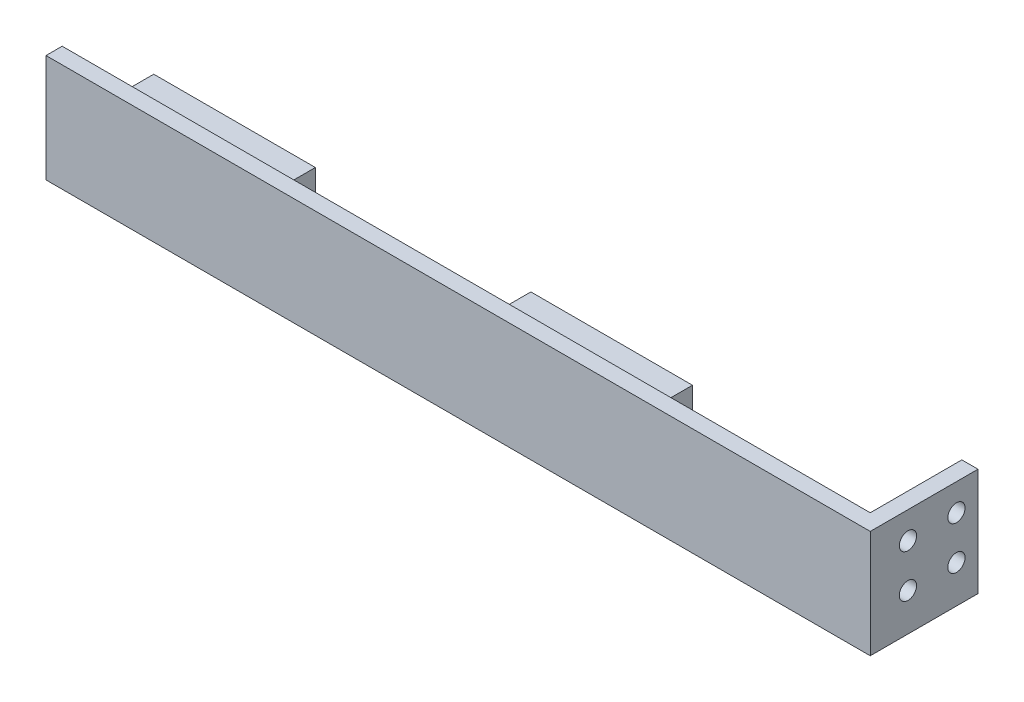
ISO-10303-21;
HEADER;
FILE_DESCRIPTION(('STEP AP214'),'2;1');
FILE_NAME('part.step','',(''),(''),'','','');
FILE_SCHEMA(('AUTOMOTIVE_DESIGN { 1 0 10303 214 1 1 1 1 }'));
ENDSEC;
DATA;
#1=APPLICATION_CONTEXT('core data for automotive mechanical design processes');
#2=APPLICATION_PROTOCOL_DEFINITION('international standard','automotive_design',2000,#1);
#3=PRODUCT_CONTEXT('',#1,'mechanical');
#4=PRODUCT('Part','Part','',(#3));
#5=PRODUCT_RELATED_PRODUCT_CATEGORY('part','',(#4));
#6=PRODUCT_DEFINITION_FORMATION('','',#4);
#7=PRODUCT_DEFINITION_CONTEXT('part definition',#1,'design');
#8=PRODUCT_DEFINITION('design','',#6,#7);
#9=PRODUCT_DEFINITION_SHAPE('','',#8);
#10=(LENGTH_UNIT() NAMED_UNIT(*) SI_UNIT(.MILLI.,.METRE.));
#11=(NAMED_UNIT(*) PLANE_ANGLE_UNIT() SI_UNIT($,.RADIAN.));
#12=(NAMED_UNIT(*) SI_UNIT($,.STERADIAN.) SOLID_ANGLE_UNIT());
#13=UNCERTAINTY_MEASURE_WITH_UNIT(LENGTH_MEASURE(1.E-05),#10,'distance_accuracy_value','');
#14=(GEOMETRIC_REPRESENTATION_CONTEXT(3) GLOBAL_UNCERTAINTY_ASSIGNED_CONTEXT((#13)) GLOBAL_UNIT_ASSIGNED_CONTEXT((#10,
#11,#12)) REPRESENTATION_CONTEXT('',''));
#15=CARTESIAN_POINT('',(0.,0.,0.));
#16=DIRECTION('',(0.,0.,1.));
#17=DIRECTION('',(1.,0.,0.));
#18=AXIS2_PLACEMENT_3D('',#15,#16,#17);
#19=CARTESIAN_POINT('',(-150.,-16.5012014745877,102.245468700612));
#20=DIRECTION('',(0.,0.707106781186551,-0.707106781186544));
#21=DIRECTION('',(-1.,0.,0.));
#22=AXIS2_PLACEMENT_3D('',#19,#20,#21);
#23=PLANE('',#22);
#24=DIRECTION('',(0.,0.707106781186544,0.707106781186551));
#25=VECTOR('',#24,1.);
#26=CARTESIAN_POINT('',(-116.9,-16.5012014745877,102.245468700612));
#27=LINE('',#26,#25);
#28=CARTESIAN_POINT('',(-116.9,-13.5012014745877,105.245468700612));
#29=VERTEX_POINT('',#28);
#30=CARTESIAN_POINT('',(-116.9,-16.5012014745877,102.245468700612));
#31=VERTEX_POINT('',#30);
#32=EDGE_CURVE('E11',#29,#31,#27,.F.);
#33=ORIENTED_EDGE('',*,*,#32,.F.);
#34=DIRECTION('',(-1.,0.,0.));
#35=VECTOR('',#34,1.);
#36=CARTESIAN_POINT('',(-120.,-13.5012014745877,105.245468700612));
#37=LINE('',#36,#35);
#38=CARTESIAN_POINT('',(-83.1,-13.5012014745877,105.245468700612));
#39=VERTEX_POINT('',#38);
#40=EDGE_CURVE('E175',#39,#29,#37,.T.);
#41=ORIENTED_EDGE('',*,*,#40,.F.);
#42=DIRECTION('',(0.,-0.707106781186544,-0.707106781186551));
#43=VECTOR('',#42,1.);
#44=CARTESIAN_POINT('',(-83.1,-16.5012014745877,102.245468700612));
#45=LINE('',#44,#43);
#46=CARTESIAN_POINT('',(-83.1,-16.5012014745877,102.245468700612));
#47=VERTEX_POINT('',#46);
#48=EDGE_CURVE('E47',#47,#39,#45,.F.);
#49=ORIENTED_EDGE('',*,*,#48,.F.);
#50=DIRECTION('',(1.,0.,0.));
#51=VECTOR('',#50,1.);
#52=CARTESIAN_POINT('',(-80.,-16.5012014745877,102.245468700612));
#53=LINE('',#52,#51);
#54=EDGE_CURVE('E176',#31,#47,#53,.T.);
#55=ORIENTED_EDGE('',*,*,#54,.F.);
#56=EDGE_LOOP('',(#33,#41,#49,#55));
#57=FACE_BOUND('',#56,.T.);
#58=ADVANCED_FACE('F39',(#57),#23,.T.);
#59=CARTESIAN_POINT('',(-150.,-16.5012014745877,102.245468700612));
#60=DIRECTION('',(0.,0.707106781186551,-0.707106781186544));
#61=DIRECTION('',(-1.,0.,0.));
#62=AXIS2_PLACEMENT_3D('',#59,#60,#61);
#63=PLANE('',#62);
#64=DIRECTION('',(0.,0.707106781186544,0.707106781186551));
#65=VECTOR('',#64,1.);
#66=CARTESIAN_POINT('',(-46.9,-16.5012014745876,102.245468700612));
#67=LINE('',#66,#65);
#68=CARTESIAN_POINT('',(-46.9,-13.5012014745877,105.245468700612));
#69=VERTEX_POINT('',#68);
#70=CARTESIAN_POINT('',(-46.9,-16.5012014745877,102.245468700612));
#71=VERTEX_POINT('',#70);
#72=EDGE_CURVE('E192',#69,#71,#67,.F.);
#73=ORIENTED_EDGE('',*,*,#72,.F.);
#74=DIRECTION('',(-1.,0.,0.));
#75=VECTOR('',#74,1.);
#76=CARTESIAN_POINT('',(-50.,-13.5012014745877,105.245468700612));
#77=LINE('',#76,#75);
#78=CARTESIAN_POINT('',(0.,-13.5012014745877,105.245468700612));
#79=VERTEX_POINT('',#78);
#80=EDGE_CURVE('E183',#79,#69,#77,.T.);
#81=ORIENTED_EDGE('',*,*,#80,.F.);
#82=DIRECTION('',(0.,-0.707106781186544,-0.707106781186551));
#83=VECTOR('',#82,1.);
#84=CARTESIAN_POINT('',(0.,-59.3733350875997,59.3733350875992));
#85=LINE('',#84,#83);
#86=CARTESIAN_POINT('',(0.,-16.5012014745877,102.245468700612));
#87=VERTEX_POINT('',#86);
#88=EDGE_CURVE('E185',#87,#79,#85,.F.);
#89=ORIENTED_EDGE('',*,*,#88,.F.);
#90=DIRECTION('',(1.,0.,0.));
#91=VECTOR('',#90,1.);
#92=CARTESIAN_POINT('',(0.,-16.5012014745877,102.245468700612));
#93=LINE('',#92,#91);
#94=EDGE_CURVE('E182',#71,#87,#93,.T.);
#95=ORIENTED_EDGE('',*,*,#94,.F.);
#96=EDGE_LOOP('',(#73,#81,#89,#95));
#97=FACE_BOUND('',#96,.T.);
#98=ADVANCED_FACE('F41',(#97),#63,.T.);
#99=CARTESIAN_POINT('',(-72.,-19.5012014745877,96.7454687006116));
#100=DIRECTION('',(0.,1.,0.));
#101=DIRECTION('',(0.,0.,1.));
#102=AXIS2_PLACEMENT_3D('',#99,#100,#101);
#103=CYLINDRICAL_SURFACE('',#102,2.1);
#104=CARTESIAN_POINT('',(-72.,-12.5012014745877,96.7454687006116));
#105=DIRECTION('',(0.,1.,0.));
#106=DIRECTION('',(0.,0.,1.));
#107=AXIS2_PLACEMENT_3D('',#104,#105,#106);
#108=CIRCLE('',#107,2.1);
#109=CARTESIAN_POINT('',(-72.,-12.5012014745877,98.8454687006116));
#110=VERTEX_POINT('',#109);
#111=EDGE_CURVE('E332',#110,#110,#108,.T.);
#112=ORIENTED_EDGE('',*,*,#111,.T.);
#113=EDGE_LOOP('',(#112));
#114=FACE_BOUND('',#113,.T.);
#115=CARTESIAN_POINT('',(-72.,-17.0012014745877,96.7454687006116));
#116=DIRECTION('',(0.,-1.,0.));
#117=DIRECTION('',(0.,0.,-1.));
#118=AXIS2_PLACEMENT_3D('',#115,#116,#117);
#119=CIRCLE('',#118,2.1);
#120=CARTESIAN_POINT('',(-72.,-17.0012014745877,94.6454687006116));
#121=VERTEX_POINT('',#120);
#122=EDGE_CURVE('E204',#121,#121,#119,.F.);
#123=ORIENTED_EDGE('',*,*,#122,.F.);
#124=EDGE_LOOP('',(#123));
#125=FACE_BOUND('',#124,.T.);
#126=ADVANCED_FACE('F423',(#114,#125),#103,.F.);
#127=CARTESIAN_POINT('',(-58.,-19.5012014745877,96.7454687006116));
#128=DIRECTION('',(0.,1.,0.));
#129=DIRECTION('',(0.,0.,1.));
#130=AXIS2_PLACEMENT_3D('',#127,#128,#129);
#131=CYLINDRICAL_SURFACE('',#130,2.04999999999999);
#132=CARTESIAN_POINT('',(-58.,-12.5012014745877,96.7454687006116));
#133=DIRECTION('',(0.,1.,0.));
#134=DIRECTION('',(0.,0.,1.));
#135=AXIS2_PLACEMENT_3D('',#132,#133,#134);
#136=CIRCLE('',#135,2.04999999999999);
#137=CARTESIAN_POINT('',(-58.,-12.5012014745877,98.7954687006116));
#138=VERTEX_POINT('',#137);
#139=EDGE_CURVE('E320',#138,#138,#136,.T.);
#140=ORIENTED_EDGE('',*,*,#139,.T.);
#141=EDGE_LOOP('',(#140));
#142=FACE_BOUND('',#141,.T.);
#143=CARTESIAN_POINT('',(-58.,-17.0012014745877,96.7454687006116));
#144=DIRECTION('',(0.,-1.,0.));
#145=DIRECTION('',(0.,0.,-1.));
#146=AXIS2_PLACEMENT_3D('',#143,#144,#145);
#147=CIRCLE('',#146,2.04999999999999);
#148=CARTESIAN_POINT('',(-58.,-17.0012014745877,94.6954687006116));
#149=VERTEX_POINT('',#148);
#150=EDGE_CURVE('E208',#149,#149,#147,.F.);
#151=ORIENTED_EDGE('',*,*,#150,.F.);
#152=EDGE_LOOP('',(#151));
#153=FACE_BOUND('',#152,.T.);
#154=ADVANCED_FACE('F490',(#142,#153),#131,.F.);
#155=CARTESIAN_POINT('',(-142.,-19.5012014745877,96.7454687006116));
#156=DIRECTION('',(0.,1.,0.));
#157=DIRECTION('',(0.,0.,1.));
#158=AXIS2_PLACEMENT_3D('',#155,#156,#157);
#159=CYLINDRICAL_SURFACE('',#158,2.09999999999999);
#160=CARTESIAN_POINT('',(-142.,-12.5012014745877,96.7454687006116));
#161=DIRECTION('',(0.,1.,0.));
#162=DIRECTION('',(0.,0.,1.));
#163=AXIS2_PLACEMENT_3D('',#160,#161,#162);
#164=CIRCLE('',#163,2.09999999999999);
#165=CARTESIAN_POINT('',(-142.,-12.5012014745877,98.8454687006116));
#166=VERTEX_POINT('',#165);
#167=EDGE_CURVE('E207',#166,#166,#164,.T.);
#168=ORIENTED_EDGE('',*,*,#167,.T.);
#169=EDGE_LOOP('',(#168));
#170=FACE_BOUND('',#169,.T.);
#171=CARTESIAN_POINT('',(-142.,-17.0012014745877,96.7454687006116));
#172=DIRECTION('',(0.,-1.,0.));
#173=DIRECTION('',(0.,0.,-1.));
#174=AXIS2_PLACEMENT_3D('',#171,#172,#173);
#175=CIRCLE('',#174,2.09999999999999);
#176=CARTESIAN_POINT('',(-142.,-17.0012014745877,94.6454687006116));
#177=VERTEX_POINT('',#176);
#178=EDGE_CURVE('E211',#177,#177,#175,.F.);
#179=ORIENTED_EDGE('',*,*,#178,.F.);
#180=EDGE_LOOP('',(#179));
#181=FACE_BOUND('',#180,.T.);
#182=ADVANCED_FACE('F487',(#170,#181),#159,.F.);
#183=CARTESIAN_POINT('',(-128.,-19.5012014745877,96.7454687006116));
#184=DIRECTION('',(0.,1.,0.));
#185=DIRECTION('',(0.,0.,1.));
#186=AXIS2_PLACEMENT_3D('',#183,#184,#185);
#187=CYLINDRICAL_SURFACE('',#186,2.10000000000002);
#188=CARTESIAN_POINT('',(-128.,-12.5012014745877,96.7454687006116));
#189=DIRECTION('',(0.,1.,0.));
#190=DIRECTION('',(0.,0.,1.));
#191=AXIS2_PLACEMENT_3D('',#188,#189,#190);
#192=CIRCLE('',#191,2.10000000000002);
#193=CARTESIAN_POINT('',(-128.,-12.5012014745877,98.8454687006116));
#194=VERTEX_POINT('',#193);
#195=EDGE_CURVE('E329',#194,#194,#192,.T.);
#196=ORIENTED_EDGE('',*,*,#195,.T.);
#197=EDGE_LOOP('',(#196));
#198=FACE_BOUND('',#197,.T.);
#199=CARTESIAN_POINT('',(-128.,-17.0012014745877,96.7454687006116));
#200=DIRECTION('',(0.,-1.,0.));
#201=DIRECTION('',(0.,0.,-1.));
#202=AXIS2_PLACEMENT_3D('',#199,#200,#201);
#203=CIRCLE('',#202,2.10000000000002);
#204=CARTESIAN_POINT('',(-128.,-17.0012014745877,94.6454687006116));
#205=VERTEX_POINT('',#204);
#206=EDGE_CURVE('E214',#205,#205,#203,.F.);
#207=ORIENTED_EDGE('',*,*,#206,.F.);
#208=EDGE_LOOP('',(#207));
#209=FACE_BOUND('',#208,.T.);
#210=ADVANCED_FACE('F449',(#198,#209),#187,.F.);
#211=CARTESIAN_POINT('',(-150.,-19.5012014745877,105.245468700612));
#212=DIRECTION('',(0.,0.,1.));
#213=DIRECTION('',(1.,0.,0.));
#214=AXIS2_PLACEMENT_3D('',#211,#212,#213);
#215=PLANE('',#214);
#216=DIRECTION('',(0.,-1.,0.));
#217=VECTOR('',#216,1.);
#218=CARTESIAN_POINT('',(-80.,-12.5012014745877,105.245468700612));
#219=LINE('',#218,#217);
#220=CARTESIAN_POINT('',(-80.,-12.5012014745877,105.245468700612));
#221=VERTEX_POINT('',#220);
#222=CARTESIAN_POINT('',(-80.,-16.5012014745877,105.245468700612));
#223=VERTEX_POINT('',#222);
#224=EDGE_CURVE('E296',#221,#223,#219,.T.);
#225=ORIENTED_EDGE('',*,*,#224,.T.);
#226=DIRECTION('',(1.,0.,0.));
#227=VECTOR('',#226,1.);
#228=CARTESIAN_POINT('',(-80.,-16.5012014745877,105.245468700612));
#229=LINE('',#228,#227);
#230=CARTESIAN_POINT('',(-83.1,-16.5012014745877,105.245468700612));
#231=VERTEX_POINT('',#230);
#232=EDGE_CURVE('E367',#231,#223,#229,.T.);
#233=ORIENTED_EDGE('',*,*,#232,.F.);
#234=DIRECTION('',(0.,-1.,0.));
#235=VECTOR('',#234,1.);
#236=CARTESIAN_POINT('',(-83.1,-13.5012014745877,105.245468700612));
#237=LINE('',#236,#235);
#238=EDGE_CURVE('E181',#39,#231,#237,.T.);
#239=ORIENTED_EDGE('',*,*,#238,.F.);
#240=ORIENTED_EDGE('',*,*,#40,.T.);
#241=DIRECTION('',(0.,-1.,0.));
#242=VECTOR('',#241,1.);
#243=CARTESIAN_POINT('',(-116.9,-13.5012014745877,105.245468700612));
#244=LINE('',#243,#242);
#245=CARTESIAN_POINT('',(-116.9,-16.5012014745877,105.245468700612));
#246=VERTEX_POINT('',#245);
#247=EDGE_CURVE('E163',#29,#246,#244,.T.);
#248=ORIENTED_EDGE('',*,*,#247,.T.);
#249=DIRECTION('',(1.,0.,0.));
#250=VECTOR('',#249,1.);
#251=CARTESIAN_POINT('',(-120.,-16.5012014745877,105.245468700612));
#252=LINE('',#251,#250);
#253=CARTESIAN_POINT('',(-120.,-16.5012014745877,105.245468700612));
#254=VERTEX_POINT('',#253);
#255=EDGE_CURVE('E366',#254,#246,#252,.T.);
#256=ORIENTED_EDGE('',*,*,#255,.F.);
#257=DIRECTION('',(0.,-1.,0.));
#258=VECTOR('',#257,1.);
#259=CARTESIAN_POINT('',(-120.,-12.5012014745877,105.245468700612));
#260=LINE('',#259,#258);
#261=CARTESIAN_POINT('',(-120.,-12.5012014745877,105.245468700612));
#262=VERTEX_POINT('',#261);
#263=EDGE_CURVE('E274',#262,#254,#260,.T.);
#264=ORIENTED_EDGE('',*,*,#263,.F.);
#265=DIRECTION('',(1.,0.,0.));
#266=VECTOR('',#265,1.);
#267=CARTESIAN_POINT('',(-150.,-12.5012014745877,105.245468700612));
#268=LINE('',#267,#266);
#269=CARTESIAN_POINT('',(-150.,-12.5012014745877,105.245468700612));
#270=VERTEX_POINT('',#269);
#271=EDGE_CURVE('E301',#270,#262,#268,.T.);
#272=ORIENTED_EDGE('',*,*,#271,.F.);
#273=DIRECTION('',(0.,-1.,0.));
#274=VECTOR('',#273,1.);
#275=CARTESIAN_POINT('',(-150.,-19.5012014745877,105.245468700612));
#276=LINE('',#275,#274);
#277=CARTESIAN_POINT('',(-150.,0.498798525412329,105.245468700612));
#278=VERTEX_POINT('',#277);
#279=EDGE_CURVE('E248',#278,#270,#276,.T.);
#280=ORIENTED_EDGE('',*,*,#279,.F.);
#281=DIRECTION('',(1.,0.,0.));
#282=VECTOR('',#281,1.);
#283=CARTESIAN_POINT('',(-150.,0.498798525412329,105.245468700612));
#284=LINE('',#283,#282);
#285=CARTESIAN_POINT('',(0.,0.498798525412329,105.245468700612));
#286=VERTEX_POINT('',#285);
#287=EDGE_CURVE('E230',#278,#286,#284,.T.);
#288=ORIENTED_EDGE('',*,*,#287,.T.);
#289=DIRECTION('',(0.,-1.,0.));
#290=VECTOR('',#289,1.);
#291=CARTESIAN_POINT('',(0.,-19.5012014745877,105.245468700612));
#292=LINE('',#291,#290);
#293=EDGE_CURVE('E241',#286,#79,#292,.T.);
#294=ORIENTED_EDGE('',*,*,#293,.T.);
#295=ORIENTED_EDGE('',*,*,#80,.T.);
#296=DIRECTION('',(0.,-1.,0.));
#297=VECTOR('',#296,1.);
#298=CARTESIAN_POINT('',(-46.9,-13.5012014745877,105.245468700612));
#299=LINE('',#298,#297);
#300=CARTESIAN_POINT('',(-46.9,-16.5012014745877,105.245468700612));
#301=VERTEX_POINT('',#300);
#302=EDGE_CURVE('E359',#69,#301,#299,.T.);
#303=ORIENTED_EDGE('',*,*,#302,.T.);
#304=DIRECTION('',(1.,0.,0.));
#305=VECTOR('',#304,1.);
#306=CARTESIAN_POINT('',(-50.,-16.5012014745877,105.245468700612));
#307=LINE('',#306,#305);
#308=CARTESIAN_POINT('',(-50.,-16.5012014745877,105.245468700612));
#309=VERTEX_POINT('',#308);
#310=EDGE_CURVE('E363',#309,#301,#307,.T.);
#311=ORIENTED_EDGE('',*,*,#310,.F.);
#312=DIRECTION('',(0.,-1.,0.));
#313=VECTOR('',#312,1.);
#314=CARTESIAN_POINT('',(-50.,-12.5012014745877,105.245468700612));
#315=LINE('',#314,#313);
#316=CARTESIAN_POINT('',(-50.,-12.5012014745877,105.245468700612));
#317=VERTEX_POINT('',#316);
#318=EDGE_CURVE('E305',#317,#309,#315,.T.);
#319=ORIENTED_EDGE('',*,*,#318,.F.);
#320=DIRECTION('',(1.,0.,0.));
#321=VECTOR('',#320,1.);
#322=CARTESIAN_POINT('',(-80.,-12.5012014745877,105.245468700612));
#323=LINE('',#322,#321);
#324=EDGE_CURVE('E324',#221,#317,#323,.T.);
#325=ORIENTED_EDGE('',*,*,#324,.F.);
#326=EDGE_LOOP('',(#225,#233,#239,#240,#248,#256,#264,#272,#280,#288,#294,#295,#303,#311,#319,#325));
#327=FACE_BOUND('',#326,.T.);
#328=ADVANCED_FACE('F178',(#327),#215,.F.);
#329=CARTESIAN_POINT('',(-150.,-16.5012014745877,88.2454687006116));
#330=DIRECTION('',(0.,-1.,0.));
#331=DIRECTION('',(0.,0.,-1.));
#332=AXIS2_PLACEMENT_3D('',#329,#330,#331);
#333=PLANE('',#332);
#334=DIRECTION('',(0.,0.,1.));
#335=VECTOR('',#334,1.);
#336=CARTESIAN_POINT('',(-80.,-16.5012014745877,105.245468700612));
#337=LINE('',#336,#335);
#338=CARTESIAN_POINT('',(-80.,-16.5012014745877,88.2454687006116));
#339=VERTEX_POINT('',#338);
#340=EDGE_CURVE('E317',#339,#223,#337,.T.);
#341=ORIENTED_EDGE('',*,*,#340,.F.);
#342=DIRECTION('',(1.,0.,0.));
#343=VECTOR('',#342,1.);
#344=CARTESIAN_POINT('',(-150.,-16.5012014745877,88.2454687006116));
#345=LINE('',#344,#343);
#346=CARTESIAN_POINT('',(-120.,-16.5012014745877,88.2454687006116));
#347=VERTEX_POINT('',#346);
#348=EDGE_CURVE('E245',#347,#339,#345,.T.);
#349=ORIENTED_EDGE('',*,*,#348,.F.);
#350=DIRECTION('',(0.,0.,-1.));
#351=VECTOR('',#350,1.);
#352=CARTESIAN_POINT('',(-120.,-16.5012014745877,88.2454687006116));
#353=LINE('',#352,#351);
#354=EDGE_CURVE('E292',#254,#347,#353,.T.);
#355=ORIENTED_EDGE('',*,*,#354,.F.);
#356=ORIENTED_EDGE('',*,*,#255,.T.);
#357=DIRECTION('',(0.,0.,-1.));
#358=VECTOR('',#357,1.);
#359=CARTESIAN_POINT('',(-116.9,-16.5012014745877,88.2454687006116));
#360=LINE('',#359,#358);
#361=EDGE_CURVE('E54',#246,#31,#360,.T.);
#362=ORIENTED_EDGE('',*,*,#361,.T.);
#363=ORIENTED_EDGE('',*,*,#54,.T.);
#364=DIRECTION('',(0.,0.,1.));
#365=VECTOR('',#364,1.);
#366=CARTESIAN_POINT('',(-83.1,-16.5012014745877,88.2454687006116));
#367=LINE('',#366,#365);
#368=EDGE_CURVE('E195',#47,#231,#367,.T.);
#369=ORIENTED_EDGE('',*,*,#368,.T.);
#370=ORIENTED_EDGE('',*,*,#232,.T.);
#371=EDGE_LOOP('',(#341,#349,#355,#356,#362,#363,#369,#370));
#372=FACE_BOUND('',#371,.T.);
#373=ADVANCED_FACE('F197',(#372),#333,.F.);
#374=DIRECTION('',(0.,0.,-1.));
#375=VECTOR('',#374,1.);
#376=CARTESIAN_POINT('',(-50.,-16.5012014745877,105.245468700612));
#377=LINE('',#376,#375);
#378=CARTESIAN_POINT('',(-50.,-16.5012014745877,88.2454687006116));
#379=VERTEX_POINT('',#378);
#380=EDGE_CURVE('E313',#309,#379,#377,.T.);
#381=ORIENTED_EDGE('',*,*,#380,.F.);
#382=ORIENTED_EDGE('',*,*,#310,.T.);
#383=DIRECTION('',(0.,0.,-1.));
#384=VECTOR('',#383,1.);
#385=CARTESIAN_POINT('',(-46.9,-16.5012014745877,88.2454687006116));
#386=LINE('',#385,#384);
#387=EDGE_CURVE('E61',#301,#71,#386,.T.);
#388=ORIENTED_EDGE('',*,*,#387,.T.);
#389=ORIENTED_EDGE('',*,*,#94,.T.);
#390=DIRECTION('',(0.,0.,-1.));
#391=VECTOR('',#390,1.);
#392=CARTESIAN_POINT('',(0.,-16.5012014745877,88.2454687006116));
#393=LINE('',#392,#391);
#394=CARTESIAN_POINT('',(0.,-16.5012014745877,88.2454687006116));
#395=VERTEX_POINT('',#394);
#396=EDGE_CURVE('E257',#87,#395,#393,.T.);
#397=ORIENTED_EDGE('',*,*,#396,.T.);
#398=EDGE_CURVE('E256',#379,#395,#345,.T.);
#399=ORIENTED_EDGE('',*,*,#398,.F.);
#400=EDGE_LOOP('',(#381,#382,#388,#389,#397,#399));
#401=FACE_BOUND('',#400,.T.);
#402=ADVANCED_FACE('F442',(#401),#333,.F.);
#403=CARTESIAN_POINT('',(0.,0.,0.));
#404=DIRECTION('',(-1.,0.,0.));
#405=DIRECTION('',(0.,0.,1.));
#406=AXIS2_PLACEMENT_3D('',#403,#404,#405);
#407=PLANE('',#406);
#408=CARTESIAN_POINT('',(0.,-12.5012014745877,101.245468700612));
#409=DIRECTION('',(1.,0.,0.));
#410=DIRECTION('',(0.,0.,-1.));
#411=AXIS2_PLACEMENT_3D('',#408,#409,#410);
#412=CIRCLE('',#411,1.6);
#413=CARTESIAN_POINT('',(0.,-12.5012014745877,99.6454687006116));
#414=VERTEX_POINT('',#413);
#415=EDGE_CURVE('E273',#414,#414,#412,.T.);
#416=ORIENTED_EDGE('',*,*,#415,.T.);
#417=EDGE_LOOP('',(#416));
#418=FACE_BOUND('',#417,.T.);
#419=CARTESIAN_POINT('',(0.,-12.5012014745877,92.2454687006116));
#420=DIRECTION('',(1.,0.,0.));
#421=DIRECTION('',(0.,0.,-1.));
#422=AXIS2_PLACEMENT_3D('',#419,#420,#421);
#423=CIRCLE('',#422,1.60000000000001);
#424=CARTESIAN_POINT('',(0.,-12.5012014745877,90.6454687006116));
#425=VERTEX_POINT('',#424);
#426=EDGE_CURVE('E280',#425,#425,#423,.T.);
#427=ORIENTED_EDGE('',*,*,#426,.T.);
#428=EDGE_LOOP('',(#427));
#429=FACE_BOUND('',#428,.T.);
#430=CARTESIAN_POINT('',(0.,-4.50120147458769,92.2454687006116));
#431=DIRECTION('',(1.,0.,0.));
#432=DIRECTION('',(0.,0.,-1.));
#433=AXIS2_PLACEMENT_3D('',#430,#431,#432);
#434=CIRCLE('',#433,1.60000000000001);
#435=CARTESIAN_POINT('',(0.,-4.50120147458769,90.6454687006116));
#436=VERTEX_POINT('',#435);
#437=EDGE_CURVE('E267',#436,#436,#434,.T.);
#438=ORIENTED_EDGE('',*,*,#437,.T.);
#439=EDGE_LOOP('',(#438));
#440=FACE_BOUND('',#439,.T.);
#441=CARTESIAN_POINT('',(0.,-4.50120147458769,101.245468700612));
#442=DIRECTION('',(1.,0.,0.));
#443=DIRECTION('',(0.,0.,-1.));
#444=AXIS2_PLACEMENT_3D('',#441,#442,#443);
#445=CIRCLE('',#444,1.60000000000001);
#446=CARTESIAN_POINT('',(0.,-4.50120147458769,99.6454687006116));
#447=VERTEX_POINT('',#446);
#448=EDGE_CURVE('E261',#447,#447,#445,.T.);
#449=ORIENTED_EDGE('',*,*,#448,.T.);
#450=EDGE_LOOP('',(#449));
#451=FACE_BOUND('',#450,.T.);
#452=ORIENTED_EDGE('',*,*,#396,.F.);
#453=ORIENTED_EDGE('',*,*,#88,.T.);
#454=ORIENTED_EDGE('',*,*,#293,.F.);
#455=DIRECTION('',(0.,0.,1.));
#456=VECTOR('',#455,1.);
#457=CARTESIAN_POINT('',(0.,0.498798525412329,88.2454687006116));
#458=LINE('',#457,#456);
#459=CARTESIAN_POINT('',(0.,0.498798525412329,88.2454687006116));
#460=VERTEX_POINT('',#459);
#461=EDGE_CURVE('E224',#460,#286,#458,.T.);
#462=ORIENTED_EDGE('',*,*,#461,.F.);
#463=DIRECTION('',(0.,1.,0.));
#464=VECTOR('',#463,1.);
#465=CARTESIAN_POINT('',(0.,0.498798525412329,88.2454687006116));
#466=LINE('',#465,#464);
#467=EDGE_CURVE('E228',#395,#460,#466,.T.);
#468=ORIENTED_EDGE('',*,*,#467,.F.);
#469=EDGE_LOOP('',(#452,#453,#454,#462,#468));
#470=FACE_BOUND('',#469,.T.);
#471=ADVANCED_FACE('F397',(#418,#429,#440,#451,#470),#407,.T.);
#472=CARTESIAN_POINT('',(3.,0.498798525412329,88.2454687006116));
#473=DIRECTION('',(0.,0.,1.));
#474=DIRECTION('',(1.,0.,0.));
#475=AXIS2_PLACEMENT_3D('',#472,#473,#474);
#476=PLANE('',#475);
#477=DIRECTION('',(-1.,0.,0.));
#478=VECTOR('',#477,1.);
#479=CARTESIAN_POINT('',(3.,-19.5012014745877,88.2454687006116));
#480=LINE('',#479,#478);
#481=CARTESIAN_POINT('',(3.,-19.5012014745877,88.2454687006116));
#482=VERTEX_POINT('',#481);
#483=CARTESIAN_POINT('',(-150.,-19.5012014745877,88.2454687006116));
#484=VERTEX_POINT('',#483);
#485=EDGE_CURVE('E221',#482,#484,#480,.T.);
#486=ORIENTED_EDGE('',*,*,#485,.T.);
#487=DIRECTION('',(0.,-1.,0.));
#488=VECTOR('',#487,1.);
#489=CARTESIAN_POINT('',(-150.,-19.5012014745877,88.2454687006116));
#490=LINE('',#489,#488);
#491=CARTESIAN_POINT('',(-150.,-12.5012014745877,88.2454687006116));
#492=VERTEX_POINT('',#491);
#493=EDGE_CURVE('E260',#492,#484,#490,.T.);
#494=ORIENTED_EDGE('',*,*,#493,.F.);
#495=DIRECTION('',(-1.,0.,0.));
#496=VECTOR('',#495,1.);
#497=CARTESIAN_POINT('',(-150.,-12.5012014745877,88.2454687006116));
#498=LINE('',#497,#496);
#499=CARTESIAN_POINT('',(-120.,-12.5012014745877,88.2454687006116));
#500=VERTEX_POINT('',#499);
#501=EDGE_CURVE('E291',#500,#492,#498,.T.);
#502=ORIENTED_EDGE('',*,*,#501,.F.);
#503=DIRECTION('',(0.,-1.,0.));
#504=VECTOR('',#503,1.);
#505=CARTESIAN_POINT('',(-120.,-12.5012014745877,88.2454687006116));
#506=LINE('',#505,#504);
#507=EDGE_CURVE('E289',#500,#347,#506,.T.);
#508=ORIENTED_EDGE('',*,*,#507,.T.);
#509=ORIENTED_EDGE('',*,*,#348,.T.);
#510=DIRECTION('',(0.,-1.,0.));
#511=VECTOR('',#510,1.);
#512=CARTESIAN_POINT('',(-80.,-12.5012014745877,88.2454687006116));
#513=LINE('',#512,#511);
#514=CARTESIAN_POINT('',(-80.,-12.5012014745877,88.2454687006116));
#515=VERTEX_POINT('',#514);
#516=EDGE_CURVE('E309',#515,#339,#513,.T.);
#517=ORIENTED_EDGE('',*,*,#516,.F.);
#518=DIRECTION('',(-1.,0.,0.));
#519=VECTOR('',#518,1.);
#520=CARTESIAN_POINT('',(-80.,-12.5012014745877,88.2454687006116));
#521=LINE('',#520,#519);
#522=CARTESIAN_POINT('',(-50.,-12.5012014745877,88.2454687006116));
#523=VERTEX_POINT('',#522);
#524=EDGE_CURVE('E312',#523,#515,#521,.T.);
#525=ORIENTED_EDGE('',*,*,#524,.F.);
#526=DIRECTION('',(0.,-1.,0.));
#527=VECTOR('',#526,1.);
#528=CARTESIAN_POINT('',(-50.,-12.5012014745877,88.2454687006116));
#529=LINE('',#528,#527);
#530=EDGE_CURVE('E307',#523,#379,#529,.T.);
#531=ORIENTED_EDGE('',*,*,#530,.T.);
#532=ORIENTED_EDGE('',*,*,#398,.T.);
#533=ORIENTED_EDGE('',*,*,#467,.T.);
#534=DIRECTION('',(-1.,0.,0.));
#535=VECTOR('',#534,1.);
#536=CARTESIAN_POINT('',(3.,0.498798525412329,88.2454687006116));
#537=LINE('',#536,#535);
#538=CARTESIAN_POINT('',(3.,0.498798525412329,88.2454687006116));
#539=VERTEX_POINT('',#538);
#540=EDGE_CURVE('E199',#539,#460,#537,.T.);
#541=ORIENTED_EDGE('',*,*,#540,.F.);
#542=DIRECTION('',(0.,1.,0.));
#543=VECTOR('',#542,1.);
#544=CARTESIAN_POINT('',(3.,0.498798525412329,88.2454687006116));
#545=LINE('',#544,#543);
#546=EDGE_CURVE('E227',#482,#539,#545,.T.);
#547=ORIENTED_EDGE('',*,*,#546,.F.);
#548=EDGE_LOOP('',(#486,#494,#502,#508,#509,#517,#525,#531,#532,#533,#541,#547));
#549=FACE_BOUND('',#548,.T.);
#550=ADVANCED_FACE('F425',(#549),#476,.F.);
#551=CARTESIAN_POINT('',(3.,0.498798525412329,88.2454687006116));
#552=DIRECTION('',(0.,-1.,0.));
#553=DIRECTION('',(0.,0.,-1.));
#554=AXIS2_PLACEMENT_3D('',#551,#552,#553);
#555=PLANE('',#554);
#556=ORIENTED_EDGE('',*,*,#461,.T.);
#557=ORIENTED_EDGE('',*,*,#287,.F.);
#558=DIRECTION('',(0.,0.,-1.));
#559=VECTOR('',#558,1.);
#560=CARTESIAN_POINT('',(-150.,0.498798525412329,108.245468700612));
#561=LINE('',#560,#559);
#562=CARTESIAN_POINT('',(-150.,0.498798525412329,108.245468700612));
#563=VERTEX_POINT('',#562);
#564=EDGE_CURVE('E251',#563,#278,#561,.T.);
#565=ORIENTED_EDGE('',*,*,#564,.F.);
#566=DIRECTION('',(-1.,0.,0.));
#567=VECTOR('',#566,1.);
#568=CARTESIAN_POINT('',(3.,0.498798525412329,108.245468700612));
#569=LINE('',#568,#567);
#570=CARTESIAN_POINT('',(3.,0.498798525412329,108.245468700612));
#571=VERTEX_POINT('',#570);
#572=EDGE_CURVE('E201',#571,#563,#569,.T.);
#573=ORIENTED_EDGE('',*,*,#572,.F.);
#574=DIRECTION('',(0.,0.,1.));
#575=VECTOR('',#574,1.);
#576=CARTESIAN_POINT('',(3.,0.498798525412329,88.2454687006116));
#577=LINE('',#576,#575);
#578=EDGE_CURVE('E234',#539,#571,#577,.T.);
#579=ORIENTED_EDGE('',*,*,#578,.F.);
#580=ORIENTED_EDGE('',*,*,#540,.T.);
#581=EDGE_LOOP('',(#556,#557,#565,#573,#579,#580));
#582=FACE_BOUND('',#581,.T.);
#583=ADVANCED_FACE('F390',(#582),#555,.F.);
#584=CARTESIAN_POINT('',(3.,0.498798525412329,108.245468700612));
#585=DIRECTION('',(0.,0.,-1.));
#586=DIRECTION('',(-1.,0.,0.));
#587=AXIS2_PLACEMENT_3D('',#584,#585,#586);
#588=PLANE('',#587);
#589=ORIENTED_EDGE('',*,*,#572,.T.);
#590=DIRECTION('',(0.,1.,0.));
#591=VECTOR('',#590,1.);
#592=CARTESIAN_POINT('',(-150.,-19.5012014745877,108.245468700612));
#593=LINE('',#592,#591);
#594=CARTESIAN_POINT('',(-150.,-19.5012014745877,108.245468700612));
#595=VERTEX_POINT('',#594);
#596=EDGE_CURVE('E244',#595,#563,#593,.T.);
#597=ORIENTED_EDGE('',*,*,#596,.F.);
#598=DIRECTION('',(-1.,0.,0.));
#599=VECTOR('',#598,1.);
#600=CARTESIAN_POINT('',(3.,-19.5012014745877,108.245468700612));
#601=LINE('',#600,#599);
#602=CARTESIAN_POINT('',(3.,-19.5012014745877,108.245468700612));
#603=VERTEX_POINT('',#602);
#604=EDGE_CURVE('E219',#603,#595,#601,.T.);
#605=ORIENTED_EDGE('',*,*,#604,.F.);
#606=DIRECTION('',(0.,-1.,0.));
#607=VECTOR('',#606,1.);
#608=CARTESIAN_POINT('',(3.,0.498798525412329,108.245468700612));
#609=LINE('',#608,#607);
#610=EDGE_CURVE('E232',#571,#603,#609,.T.);
#611=ORIENTED_EDGE('',*,*,#610,.F.);
#612=EDGE_LOOP('',(#589,#597,#605,#611));
#613=FACE_BOUND('',#612,.T.);
#614=ADVANCED_FACE('F431',(#613),#588,.F.);
#615=CARTESIAN_POINT('',(3.,-19.5012014745877,88.2454687006116));
#616=DIRECTION('',(0.,1.,0.));
#617=DIRECTION('',(0.,0.,1.));
#618=AXIS2_PLACEMENT_3D('',#615,#616,#617);
#619=PLANE('',#618);
#620=CARTESIAN_POINT('',(-142.,-19.5012014745877,96.7454687006116));
#621=DIRECTION('',(0.,-1.,0.));
#622=DIRECTION('',(0.,0.,-1.));
#623=AXIS2_PLACEMENT_3D('',#620,#621,#622);
#624=CIRCLE('',#623,3.99999999999999);
#625=CARTESIAN_POINT('',(-142.,-19.5012014745877,92.7454687006116));
#626=VERTEX_POINT('',#625);
#627=EDGE_CURVE('E354',#626,#626,#624,.T.);
#628=ORIENTED_EDGE('',*,*,#627,.F.);
#629=EDGE_LOOP('',(#628));
#630=FACE_BOUND('',#629,.T.);
#631=CARTESIAN_POINT('',(-128.,-19.5012014745877,96.7454687006116));
#632=DIRECTION('',(0.,-1.,0.));
#633=DIRECTION('',(0.,0.,-1.));
#634=AXIS2_PLACEMENT_3D('',#631,#632,#633);
#635=CIRCLE('',#634,4.00000000000001);
#636=CARTESIAN_POINT('',(-128.,-19.5012014745877,92.7454687006116));
#637=VERTEX_POINT('',#636);
#638=EDGE_CURVE('E348',#637,#637,#635,.T.);
#639=ORIENTED_EDGE('',*,*,#638,.F.);
#640=EDGE_LOOP('',(#639));
#641=FACE_BOUND('',#640,.T.);
#642=CARTESIAN_POINT('',(-72.,-19.5012014745877,96.7454687006116));
#643=DIRECTION('',(0.,-1.,0.));
#644=DIRECTION('',(0.,0.,-1.));
#645=AXIS2_PLACEMENT_3D('',#642,#643,#644);
#646=CIRCLE('',#645,4.00000000000001);
#647=CARTESIAN_POINT('',(-72.,-19.5012014745877,92.7454687006116));
#648=VERTEX_POINT('',#647);
#649=EDGE_CURVE('E342',#648,#648,#646,.T.);
#650=ORIENTED_EDGE('',*,*,#649,.F.);
#651=EDGE_LOOP('',(#650));
#652=FACE_BOUND('',#651,.T.);
#653=CARTESIAN_POINT('',(-58.,-19.5012014745877,96.7454687006116));
#654=DIRECTION('',(0.,-1.,0.));
#655=DIRECTION('',(0.,0.,-1.));
#656=AXIS2_PLACEMENT_3D('',#653,#654,#655);
#657=CIRCLE('',#656,4.);
#658=CARTESIAN_POINT('',(-58.,-19.5012014745877,92.7454687006116));
#659=VERTEX_POINT('',#658);
#660=EDGE_CURVE('E170',#659,#659,#657,.T.);
#661=ORIENTED_EDGE('',*,*,#660,.F.);
#662=EDGE_LOOP('',(#661));
#663=FACE_BOUND('',#662,.T.);
#664=DIRECTION('',(0.,0.,1.));
#665=VECTOR('',#664,1.);
#666=CARTESIAN_POINT('',(-150.,-19.5012014745877,108.245468700612));
#667=LINE('',#666,#665);
#668=EDGE_CURVE('E240',#484,#595,#667,.T.);
#669=ORIENTED_EDGE('',*,*,#668,.F.);
#670=ORIENTED_EDGE('',*,*,#485,.F.);
#671=DIRECTION('',(0.,0.,-1.));
#672=VECTOR('',#671,1.);
#673=CARTESIAN_POINT('',(3.,-19.5012014745877,88.2454687006116));
#674=LINE('',#673,#672);
#675=EDGE_CURVE('E223',#603,#482,#674,.T.);
#676=ORIENTED_EDGE('',*,*,#675,.F.);
#677=ORIENTED_EDGE('',*,*,#604,.T.);
#678=EDGE_LOOP('',(#669,#670,#676,#677));
#679=FACE_BOUND('',#678,.T.);
#680=ADVANCED_FACE('F434',(#630,#641,#652,#663,#679),#619,.F.);
#681=CARTESIAN_POINT('',(3.,0.,0.));
#682=DIRECTION('',(-1.,0.,0.));
#683=DIRECTION('',(0.,0.,1.));
#684=AXIS2_PLACEMENT_3D('',#681,#682,#683);
#685=PLANE('',#684);
#686=CARTESIAN_POINT('',(3.,-12.5012014745877,101.245468700612));
#687=DIRECTION('',(1.,0.,0.));
#688=DIRECTION('',(0.,0.,-1.));
#689=AXIS2_PLACEMENT_3D('',#686,#687,#688);
#690=CIRCLE('',#689,1.6);
#691=CARTESIAN_POINT('',(3.,-12.5012014745877,99.6454687006116));
#692=VERTEX_POINT('',#691);
#693=EDGE_CURVE('E270',#692,#692,#690,.T.);
#694=ORIENTED_EDGE('',*,*,#693,.F.);
#695=EDGE_LOOP('',(#694));
#696=FACE_BOUND('',#695,.T.);
#697=CARTESIAN_POINT('',(3.,-12.5012014745877,92.2454687006116));
#698=DIRECTION('',(1.,0.,0.));
#699=DIRECTION('',(0.,0.,-1.));
#700=AXIS2_PLACEMENT_3D('',#697,#698,#699);
#701=CIRCLE('',#700,1.60000000000001);
#702=CARTESIAN_POINT('',(3.,-12.5012014745877,90.6454687006116));
#703=VERTEX_POINT('',#702);
#704=EDGE_CURVE('E277',#703,#703,#701,.T.);
#705=ORIENTED_EDGE('',*,*,#704,.F.);
#706=EDGE_LOOP('',(#705));
#707=FACE_BOUND('',#706,.T.);
#708=CARTESIAN_POINT('',(3.,-4.50120147458769,92.2454687006116));
#709=DIRECTION('',(1.,0.,0.));
#710=DIRECTION('',(0.,0.,-1.));
#711=AXIS2_PLACEMENT_3D('',#708,#709,#710);
#712=CIRCLE('',#711,1.60000000000001);
#713=CARTESIAN_POINT('',(3.,-4.50120147458769,90.6454687006116));
#714=VERTEX_POINT('',#713);
#715=EDGE_CURVE('E283',#714,#714,#712,.T.);
#716=ORIENTED_EDGE('',*,*,#715,.F.);
#717=EDGE_LOOP('',(#716));
#718=FACE_BOUND('',#717,.T.);
#719=CARTESIAN_POINT('',(3.,-4.50120147458769,101.245468700612));
#720=DIRECTION('',(1.,0.,0.));
#721=DIRECTION('',(0.,0.,-1.));
#722=AXIS2_PLACEMENT_3D('',#719,#720,#721);
#723=CIRCLE('',#722,1.60000000000001);
#724=CARTESIAN_POINT('',(3.,-4.50120147458769,99.6454687006116));
#725=VERTEX_POINT('',#724);
#726=EDGE_CURVE('E264',#725,#725,#723,.T.);
#727=ORIENTED_EDGE('',*,*,#726,.F.);
#728=EDGE_LOOP('',(#727));
#729=FACE_BOUND('',#728,.T.);
#730=ORIENTED_EDGE('',*,*,#546,.T.);
#731=ORIENTED_EDGE('',*,*,#578,.T.);
#732=ORIENTED_EDGE('',*,*,#610,.T.);
#733=ORIENTED_EDGE('',*,*,#675,.T.);
#734=EDGE_LOOP('',(#730,#731,#732,#733));
#735=FACE_BOUND('',#734,.T.);
#736=ADVANCED_FACE('F438',(#696,#707,#718,#729,#735),#685,.F.);
#737=CARTESIAN_POINT('',(-150.,0.,0.));
#738=DIRECTION('',(-1.,0.,0.));
#739=DIRECTION('',(0.,0.,1.));
#740=AXIS2_PLACEMENT_3D('',#737,#738,#739);
#741=PLANE('',#740);
#742=ORIENTED_EDGE('',*,*,#596,.T.);
#743=ORIENTED_EDGE('',*,*,#564,.T.);
#744=ORIENTED_EDGE('',*,*,#279,.T.);
#745=DIRECTION('',(0.,0.,1.));
#746=VECTOR('',#745,1.);
#747=CARTESIAN_POINT('',(-150.,-12.5012014745877,88.2454687006116));
#748=LINE('',#747,#746);
#749=EDGE_CURVE('E295',#492,#270,#748,.T.);
#750=ORIENTED_EDGE('',*,*,#749,.F.);
#751=ORIENTED_EDGE('',*,*,#493,.T.);
#752=ORIENTED_EDGE('',*,*,#668,.T.);
#753=EDGE_LOOP('',(#742,#743,#744,#750,#751,#752));
#754=FACE_BOUND('',#753,.T.);
#755=ADVANCED_FACE('F385',(#754),#741,.T.);
#756=CARTESIAN_POINT('',(0.,-4.50120147458769,101.245468700612));
#757=DIRECTION('',(1.,0.,0.));
#758=DIRECTION('',(0.,0.,-1.));
#759=AXIS2_PLACEMENT_3D('',#756,#757,#758);
#760=CYLINDRICAL_SURFACE('',#759,1.60000000000001);
#761=ORIENTED_EDGE('',*,*,#448,.F.);
#762=EDGE_LOOP('',(#761));
#763=FACE_BOUND('',#762,.T.);
#764=ORIENTED_EDGE('',*,*,#726,.T.);
#765=EDGE_LOOP('',(#764));
#766=FACE_BOUND('',#765,.T.);
#767=ADVANCED_FACE('F452',(#763,#766),#760,.F.);
#768=CARTESIAN_POINT('',(0.,-4.50120147458769,92.2454687006116));
#769=DIRECTION('',(1.,0.,0.));
#770=DIRECTION('',(0.,0.,-1.));
#771=AXIS2_PLACEMENT_3D('',#768,#769,#770);
#772=CYLINDRICAL_SURFACE('',#771,1.60000000000001);
#773=ORIENTED_EDGE('',*,*,#437,.F.);
#774=EDGE_LOOP('',(#773));
#775=FACE_BOUND('',#774,.T.);
#776=ORIENTED_EDGE('',*,*,#715,.T.);
#777=EDGE_LOOP('',(#776));
#778=FACE_BOUND('',#777,.T.);
#779=ADVANCED_FACE('F457',(#775,#778),#772,.F.);
#780=CARTESIAN_POINT('',(0.,-12.5012014745877,92.2454687006116));
#781=DIRECTION('',(1.,0.,0.));
#782=DIRECTION('',(0.,0.,-1.));
#783=AXIS2_PLACEMENT_3D('',#780,#781,#782);
#784=CYLINDRICAL_SURFACE('',#783,1.60000000000001);
#785=ORIENTED_EDGE('',*,*,#426,.F.);
#786=EDGE_LOOP('',(#785));
#787=FACE_BOUND('',#786,.T.);
#788=ORIENTED_EDGE('',*,*,#704,.T.);
#789=EDGE_LOOP('',(#788));
#790=FACE_BOUND('',#789,.T.);
#791=ADVANCED_FACE('F461',(#787,#790),#784,.F.);
#792=CARTESIAN_POINT('',(0.,-12.5012014745877,101.245468700612));
#793=DIRECTION('',(1.,0.,0.));
#794=DIRECTION('',(0.,0.,-1.));
#795=AXIS2_PLACEMENT_3D('',#792,#793,#794);
#796=CYLINDRICAL_SURFACE('',#795,1.6);
#797=ORIENTED_EDGE('',*,*,#415,.F.);
#798=EDGE_LOOP('',(#797));
#799=FACE_BOUND('',#798,.T.);
#800=ORIENTED_EDGE('',*,*,#693,.T.);
#801=EDGE_LOOP('',(#800));
#802=FACE_BOUND('',#801,.T.);
#803=ADVANCED_FACE('F459',(#799,#802),#796,.F.);
#804=CARTESIAN_POINT('',(-120.,-12.5012014745877,88.2454687006116));
#805=DIRECTION('',(-1.,0.,0.));
#806=DIRECTION('',(0.,0.,1.));
#807=AXIS2_PLACEMENT_3D('',#804,#805,#806);
#808=PLANE('',#807);
#809=ORIENTED_EDGE('',*,*,#263,.T.);
#810=ORIENTED_EDGE('',*,*,#354,.T.);
#811=ORIENTED_EDGE('',*,*,#507,.F.);
#812=DIRECTION('',(0.,0.,-1.));
#813=VECTOR('',#812,1.);
#814=CARTESIAN_POINT('',(-120.,-12.5012014745877,88.2454687006116));
#815=LINE('',#814,#813);
#816=EDGE_CURVE('E299',#262,#500,#815,.T.);
#817=ORIENTED_EDGE('',*,*,#816,.F.);
#818=EDGE_LOOP('',(#809,#810,#811,#817));
#819=FACE_BOUND('',#818,.T.);
#820=ADVANCED_FACE('F378',(#819),#808,.F.);
#821=CARTESIAN_POINT('',(0.,-12.5012014745877,0.));
#822=DIRECTION('',(0.,1.,0.));
#823=DIRECTION('',(0.,0.,1.));
#824=AXIS2_PLACEMENT_3D('',#821,#822,#823);
#825=PLANE('',#824);
#826=ORIENTED_EDGE('',*,*,#195,.F.);
#827=EDGE_LOOP('',(#826));
#828=FACE_BOUND('',#827,.T.);
#829=ORIENTED_EDGE('',*,*,#167,.F.);
#830=EDGE_LOOP('',(#829));
#831=FACE_BOUND('',#830,.T.);
#832=ORIENTED_EDGE('',*,*,#749,.T.);
#833=ORIENTED_EDGE('',*,*,#271,.T.);
#834=ORIENTED_EDGE('',*,*,#816,.T.);
#835=ORIENTED_EDGE('',*,*,#501,.T.);
#836=EDGE_LOOP('',(#832,#833,#834,#835));
#837=FACE_BOUND('',#836,.T.);
#838=ADVANCED_FACE('F382',(#828,#831,#837),#825,.T.);
#839=CARTESIAN_POINT('',(-80.,-12.5012014745877,105.245468700612));
#840=DIRECTION('',(1.,0.,0.));
#841=DIRECTION('',(0.,0.,-1.));
#842=AXIS2_PLACEMENT_3D('',#839,#840,#841);
#843=PLANE('',#842);
#844=ORIENTED_EDGE('',*,*,#340,.T.);
#845=ORIENTED_EDGE('',*,*,#224,.F.);
#846=DIRECTION('',(0.,0.,1.));
#847=VECTOR('',#846,1.);
#848=CARTESIAN_POINT('',(-80.,-12.5012014745877,105.245468700612));
#849=LINE('',#848,#847);
#850=EDGE_CURVE('E316',#515,#221,#849,.T.);
#851=ORIENTED_EDGE('',*,*,#850,.F.);
#852=ORIENTED_EDGE('',*,*,#516,.T.);
#853=EDGE_LOOP('',(#844,#845,#851,#852));
#854=FACE_BOUND('',#853,.T.);
#855=ADVANCED_FACE('F473',(#854),#843,.F.);
#856=CARTESIAN_POINT('',(-50.,-12.5012014745877,105.245468700612));
#857=DIRECTION('',(-1.,0.,0.));
#858=DIRECTION('',(0.,0.,1.));
#859=AXIS2_PLACEMENT_3D('',#856,#857,#858);
#860=PLANE('',#859);
#861=ORIENTED_EDGE('',*,*,#318,.T.);
#862=ORIENTED_EDGE('',*,*,#380,.T.);
#863=ORIENTED_EDGE('',*,*,#530,.F.);
#864=DIRECTION('',(0.,0.,-1.));
#865=VECTOR('',#864,1.);
#866=CARTESIAN_POINT('',(-50.,-12.5012014745877,105.245468700612));
#867=LINE('',#866,#865);
#868=EDGE_CURVE('E322',#317,#523,#867,.T.);
#869=ORIENTED_EDGE('',*,*,#868,.F.);
#870=EDGE_LOOP('',(#861,#862,#863,#869));
#871=FACE_BOUND('',#870,.T.);
#872=ADVANCED_FACE('F477',(#871),#860,.F.);
#873=CARTESIAN_POINT('',(0.,-12.5012014745877,0.));
#874=DIRECTION('',(0.,-1.,0.));
#875=DIRECTION('',(0.,0.,-1.));
#876=AXIS2_PLACEMENT_3D('',#873,#874,#875);
#877=PLANE('',#876);
#878=ORIENTED_EDGE('',*,*,#139,.F.);
#879=EDGE_LOOP('',(#878));
#880=FACE_BOUND('',#879,.T.);
#881=ORIENTED_EDGE('',*,*,#111,.F.);
#882=EDGE_LOOP('',(#881));
#883=FACE_BOUND('',#882,.T.);
#884=ORIENTED_EDGE('',*,*,#850,.T.);
#885=ORIENTED_EDGE('',*,*,#324,.T.);
#886=ORIENTED_EDGE('',*,*,#868,.T.);
#887=ORIENTED_EDGE('',*,*,#524,.T.);
#888=EDGE_LOOP('',(#884,#885,#886,#887));
#889=FACE_BOUND('',#888,.T.);
#890=ADVANCED_FACE('F481',(#880,#883,#889),#877,.F.);
#891=CARTESIAN_POINT('',(-128.,-17.0012014745877,96.7454687006116));
#892=DIRECTION('',(0.,-1.,0.));
#893=DIRECTION('',(0.,0.,-1.));
#894=AXIS2_PLACEMENT_3D('',#891,#892,#893);
#895=PLANE('',#894);
#896=CARTESIAN_POINT('',(-128.,-17.0012014745877,96.7454687006116));
#897=DIRECTION('',(0.,-1.,0.));
#898=DIRECTION('',(0.,0.,-1.));
#899=AXIS2_PLACEMENT_3D('',#896,#897,#898);
#900=CIRCLE('',#899,4.00000000000001);
#901=CARTESIAN_POINT('',(-128.,-17.0012014745877,92.7454687006116));
#902=VERTEX_POINT('',#901);
#903=EDGE_CURVE('E351',#902,#902,#900,.T.);
#904=ORIENTED_EDGE('',*,*,#903,.T.);
#905=EDGE_LOOP('',(#904));
#906=FACE_BOUND('',#905,.T.);
#907=ORIENTED_EDGE('',*,*,#206,.T.);
#908=EDGE_LOOP('',(#907));
#909=FACE_BOUND('',#908,.T.);
#910=ADVANCED_FACE('F485',(#906,#909),#895,.T.);
#911=CARTESIAN_POINT('',(-128.,-17.0012014745877,96.7454687006116));
#912=DIRECTION('',(0.,-1.,0.));
#913=DIRECTION('',(0.,0.,-1.));
#914=AXIS2_PLACEMENT_3D('',#911,#912,#913);
#915=CYLINDRICAL_SURFACE('',#914,4.00000000000001);
#916=ORIENTED_EDGE('',*,*,#903,.F.);
#917=EDGE_LOOP('',(#916));
#918=FACE_BOUND('',#917,.T.);
#919=ORIENTED_EDGE('',*,*,#638,.T.);
#920=EDGE_LOOP('',(#919));
#921=FACE_BOUND('',#920,.T.);
#922=ADVANCED_FACE('F513',(#918,#921),#915,.F.);
#923=CARTESIAN_POINT('',(-142.,-17.0012014745877,96.7454687006116));
#924=DIRECTION('',(0.,-1.,0.));
#925=DIRECTION('',(0.,0.,-1.));
#926=AXIS2_PLACEMENT_3D('',#923,#924,#925);
#927=PLANE('',#926);
#928=CARTESIAN_POINT('',(-142.,-17.0012014745877,96.7454687006116));
#929=DIRECTION('',(0.,-1.,0.));
#930=DIRECTION('',(0.,0.,-1.));
#931=AXIS2_PLACEMENT_3D('',#928,#929,#930);
#932=CIRCLE('',#931,3.99999999999999);
#933=CARTESIAN_POINT('',(-142.,-17.0012014745877,92.7454687006116));
#934=VERTEX_POINT('',#933);
#935=EDGE_CURVE('E216',#934,#934,#932,.T.);
#936=ORIENTED_EDGE('',*,*,#935,.T.);
#937=EDGE_LOOP('',(#936));
#938=FACE_BOUND('',#937,.T.);
#939=ORIENTED_EDGE('',*,*,#178,.T.);
#940=EDGE_LOOP('',(#939));
#941=FACE_BOUND('',#940,.T.);
#942=ADVANCED_FACE('F516',(#938,#941),#927,.T.);
#943=CARTESIAN_POINT('',(-142.,-17.0012014745877,96.7454687006116));
#944=DIRECTION('',(0.,-1.,0.));
#945=DIRECTION('',(0.,0.,-1.));
#946=AXIS2_PLACEMENT_3D('',#943,#944,#945);
#947=CYLINDRICAL_SURFACE('',#946,3.99999999999999);
#948=ORIENTED_EDGE('',*,*,#935,.F.);
#949=EDGE_LOOP('',(#948));
#950=FACE_BOUND('',#949,.T.);
#951=ORIENTED_EDGE('',*,*,#627,.T.);
#952=EDGE_LOOP('',(#951));
#953=FACE_BOUND('',#952,.T.);
#954=ADVANCED_FACE('F507',(#950,#953),#947,.F.);
#955=CARTESIAN_POINT('',(-58.,-17.0012014745877,96.7454687006116));
#956=DIRECTION('',(0.,-1.,0.));
#957=DIRECTION('',(0.,0.,-1.));
#958=AXIS2_PLACEMENT_3D('',#955,#956,#957);
#959=PLANE('',#958);
#960=CARTESIAN_POINT('',(-58.,-17.0012014745877,96.7454687006116));
#961=DIRECTION('',(0.,-1.,0.));
#962=DIRECTION('',(0.,0.,-1.));
#963=AXIS2_PLACEMENT_3D('',#960,#961,#962);
#964=CIRCLE('',#963,4.);
#965=CARTESIAN_POINT('',(-58.,-17.0012014745877,92.7454687006116));
#966=VERTEX_POINT('',#965);
#967=EDGE_CURVE('E339',#966,#966,#964,.T.);
#968=ORIENTED_EDGE('',*,*,#967,.T.);
#969=EDGE_LOOP('',(#968));
#970=FACE_BOUND('',#969,.T.);
#971=ORIENTED_EDGE('',*,*,#150,.T.);
#972=EDGE_LOOP('',(#971));
#973=FACE_BOUND('',#972,.T.);
#974=ADVANCED_FACE('F504',(#970,#973),#959,.T.);
#975=CARTESIAN_POINT('',(-58.,-17.0012014745877,96.7454687006116));
#976=DIRECTION('',(0.,-1.,0.));
#977=DIRECTION('',(0.,0.,-1.));
#978=AXIS2_PLACEMENT_3D('',#975,#976,#977);
#979=CYLINDRICAL_SURFACE('',#978,4.);
#980=ORIENTED_EDGE('',*,*,#967,.F.);
#981=EDGE_LOOP('',(#980));
#982=FACE_BOUND('',#981,.T.);
#983=ORIENTED_EDGE('',*,*,#660,.T.);
#984=EDGE_LOOP('',(#983));
#985=FACE_BOUND('',#984,.T.);
#986=ADVANCED_FACE('F501',(#982,#985),#979,.F.);
#987=CARTESIAN_POINT('',(-72.,-17.0012014745877,96.7454687006116));
#988=DIRECTION('',(0.,-1.,0.));
#989=DIRECTION('',(0.,0.,-1.));
#990=AXIS2_PLACEMENT_3D('',#987,#988,#989);
#991=PLANE('',#990);
#992=CARTESIAN_POINT('',(-72.,-17.0012014745877,96.7454687006116));
#993=DIRECTION('',(0.,-1.,0.));
#994=DIRECTION('',(0.,0.,-1.));
#995=AXIS2_PLACEMENT_3D('',#992,#993,#994);
#996=CIRCLE('',#995,4.00000000000001);
#997=CARTESIAN_POINT('',(-72.,-17.0012014745877,92.7454687006116));
#998=VERTEX_POINT('',#997);
#999=EDGE_CURVE('E345',#998,#998,#996,.T.);
#1000=ORIENTED_EDGE('',*,*,#999,.T.);
#1001=EDGE_LOOP('',(#1000));
#1002=FACE_BOUND('',#1001,.T.);
#1003=ORIENTED_EDGE('',*,*,#122,.T.);
#1004=EDGE_LOOP('',(#1003));
#1005=FACE_BOUND('',#1004,.T.);
#1006=ADVANCED_FACE('F414',(#1002,#1005),#991,.T.);
#1007=CARTESIAN_POINT('',(-72.,-17.0012014745877,96.7454687006116));
#1008=DIRECTION('',(0.,-1.,0.));
#1009=DIRECTION('',(0.,0.,-1.));
#1010=AXIS2_PLACEMENT_3D('',#1007,#1008,#1009);
#1011=CYLINDRICAL_SURFACE('',#1010,4.00000000000001);
#1012=ORIENTED_EDGE('',*,*,#999,.F.);
#1013=EDGE_LOOP('',(#1012));
#1014=FACE_BOUND('',#1013,.T.);
#1015=ORIENTED_EDGE('',*,*,#649,.T.);
#1016=EDGE_LOOP('',(#1015));
#1017=FACE_BOUND('',#1016,.T.);
#1018=ADVANCED_FACE('F407',(#1014,#1017),#1011,.F.);
#1019=CARTESIAN_POINT('',(-46.9,-13.5012014745877,88.2454687006116));
#1020=DIRECTION('',(-1.,0.,0.));
#1021=DIRECTION('',(0.,0.,1.));
#1022=AXIS2_PLACEMENT_3D('',#1019,#1020,#1021);
#1023=PLANE('',#1022);
#1024=ORIENTED_EDGE('',*,*,#72,.T.);
#1025=ORIENTED_EDGE('',*,*,#387,.F.);
#1026=ORIENTED_EDGE('',*,*,#302,.F.);
#1027=EDGE_LOOP('',(#1024,#1025,#1026));
#1028=FACE_BOUND('',#1027,.T.);
#1029=ADVANCED_FACE('F405',(#1028),#1023,.T.);
#1030=CARTESIAN_POINT('',(-83.1,-13.5012014745877,88.2454687006116));
#1031=DIRECTION('',(1.,0.,0.));
#1032=DIRECTION('',(0.,0.,-1.));
#1033=AXIS2_PLACEMENT_3D('',#1030,#1031,#1032);
#1034=PLANE('',#1033);
#1035=ORIENTED_EDGE('',*,*,#48,.T.);
#1036=ORIENTED_EDGE('',*,*,#238,.T.);
#1037=ORIENTED_EDGE('',*,*,#368,.F.);
#1038=EDGE_LOOP('',(#1035,#1036,#1037));
#1039=FACE_BOUND('',#1038,.T.);
#1040=ADVANCED_FACE('F194',(#1039),#1034,.T.);
#1041=CARTESIAN_POINT('',(-116.9,-13.5012014745877,88.2454687006116));
#1042=DIRECTION('',(-1.,0.,0.));
#1043=DIRECTION('',(0.,0.,1.));
#1044=AXIS2_PLACEMENT_3D('',#1041,#1042,#1043);
#1045=PLANE('',#1044);
#1046=ORIENTED_EDGE('',*,*,#32,.T.);
#1047=ORIENTED_EDGE('',*,*,#361,.F.);
#1048=ORIENTED_EDGE('',*,*,#247,.F.);
#1049=EDGE_LOOP('',(#1046,#1047,#1048));
#1050=FACE_BOUND('',#1049,.T.);
#1051=ADVANCED_FACE('F165',(#1050),#1045,.T.);
#1052=CLOSED_SHELL('',(#58,#98,#126,#154,#182,#210,#328,#373,#402,#471,#550,#583,#614,#680,#736,
#755,#767,#779,#791,#803,#820,#838,#855,#872,#890,#910,#922,#942,#954,#974,#986,#1006,#1018,
#1029,#1040,#1051));
#1053=MANIFOLD_SOLID_BREP('B2',#1052);
#1054=ADVANCED_BREP_SHAPE_REPRESENTATION('',(#18,#1053),#14);
#1055=SHAPE_DEFINITION_REPRESENTATION(#9,#1054);
ENDSEC;
END-ISO-10303-21;
